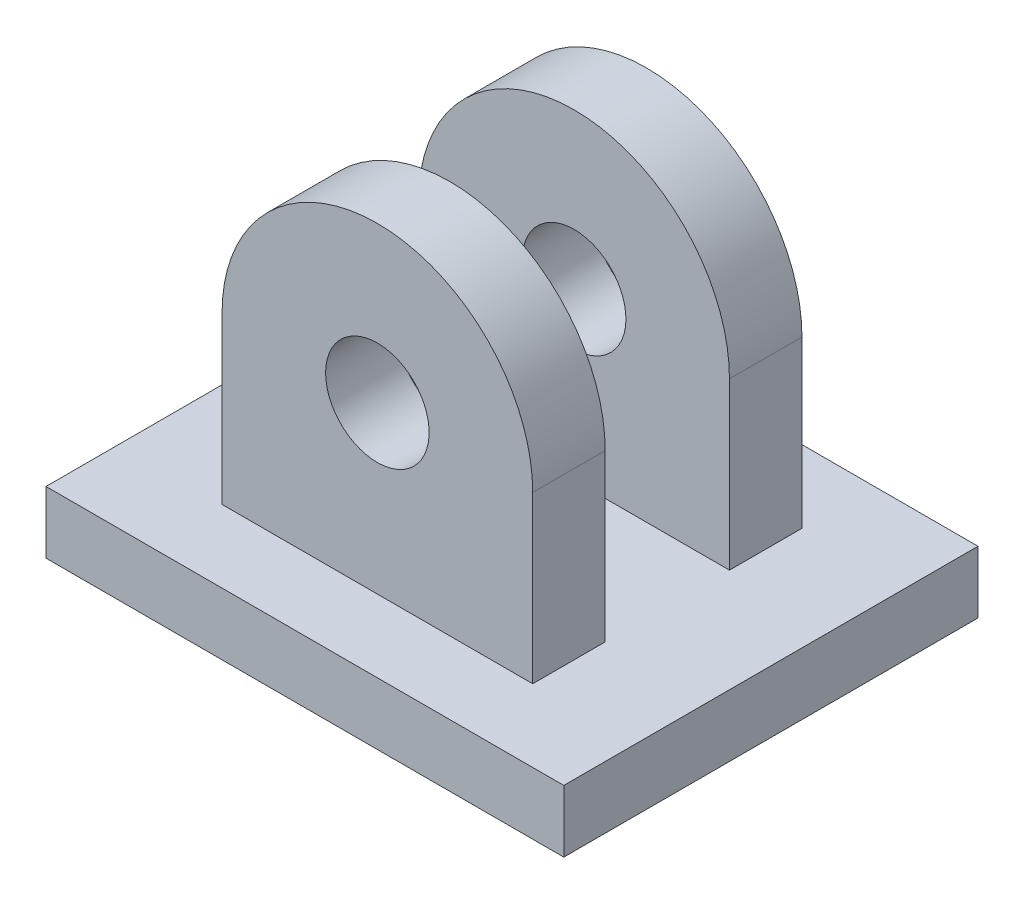
ISO-10303-21;
HEADER;
FILE_DESCRIPTION(('STEP AP214'),'2;1');
FILE_NAME('part.step','',(''),(''),'','','');
FILE_SCHEMA(('AUTOMOTIVE_DESIGN { 1 0 10303 214 1 1 1 1 }'));
ENDSEC;
DATA;
#1=APPLICATION_CONTEXT('core data for automotive mechanical design processes');
#2=APPLICATION_PROTOCOL_DEFINITION('international standard','automotive_design',2000,#1);
#3=PRODUCT_CONTEXT('',#1,'mechanical');
#4=PRODUCT('Part','Part','',(#3));
#5=PRODUCT_RELATED_PRODUCT_CATEGORY('part','',(#4));
#6=PRODUCT_DEFINITION_FORMATION('','',#4);
#7=PRODUCT_DEFINITION_CONTEXT('part definition',#1,'design');
#8=PRODUCT_DEFINITION('design','',#6,#7);
#9=PRODUCT_DEFINITION_SHAPE('','',#8);
#10=(LENGTH_UNIT() NAMED_UNIT(*) SI_UNIT(.MILLI.,.METRE.));
#11=(NAMED_UNIT(*) PLANE_ANGLE_UNIT() SI_UNIT($,.RADIAN.));
#12=(NAMED_UNIT(*) SI_UNIT($,.STERADIAN.) SOLID_ANGLE_UNIT());
#13=UNCERTAINTY_MEASURE_WITH_UNIT(LENGTH_MEASURE(1.E-05),#10,'distance_accuracy_value','');
#14=(GEOMETRIC_REPRESENTATION_CONTEXT(3) GLOBAL_UNCERTAINTY_ASSIGNED_CONTEXT((#13)) GLOBAL_UNIT_ASSIGNED_CONTEXT((#10,
#11,#12)) REPRESENTATION_CONTEXT('',''));
#15=CARTESIAN_POINT('',(0.,0.,0.));
#16=DIRECTION('',(0.,0.,1.));
#17=DIRECTION('',(1.,0.,0.));
#18=AXIS2_PLACEMENT_3D('',#15,#16,#17);
#19=CARTESIAN_POINT('',(15.,0.,40.));
#20=DIRECTION('',(-1.,0.,0.));
#21=DIRECTION('',(0.,-1.,0.));
#22=AXIS2_PLACEMENT_3D('',#19,#20,#21);
#23=PLANE('',#22);
#24=DIRECTION('',(0.,0.,-1.));
#25=VECTOR('',#24,1.);
#26=CARTESIAN_POINT('',(15.,-16.,40.));
#27=LINE('',#26,#25);
#28=CARTESIAN_POINT('',(15.,-16.,33.));
#29=VERTEX_POINT('',#28);
#30=CARTESIAN_POINT('',(15.,-16.,26.));
#31=VERTEX_POINT('',#30);
#32=EDGE_CURVE('E40',#29,#31,#27,.T.);
#33=ORIENTED_EDGE('',*,*,#32,.T.);
#34=DIRECTION('',(0.,-1.,0.));
#35=VECTOR('',#34,1.);
#36=CARTESIAN_POINT('',(15.,18.4995185574231,26.));
#37=LINE('',#36,#35);
#38=CARTESIAN_POINT('',(15.,0.,26.));
#39=VERTEX_POINT('',#38);
#40=EDGE_CURVE('E48',#39,#31,#37,.T.);
#41=ORIENTED_EDGE('',*,*,#40,.F.);
#42=DIRECTION('',(0.,0.,-1.));
#43=VECTOR('',#42,1.);
#44=CARTESIAN_POINT('',(15.,0.,40.));
#45=LINE('',#44,#43);
#46=CARTESIAN_POINT('',(15.,0.,33.));
#47=VERTEX_POINT('',#46);
#48=EDGE_CURVE('E143',#47,#39,#45,.T.);
#49=ORIENTED_EDGE('',*,*,#48,.F.);
#50=DIRECTION('',(0.,1.,0.));
#51=VECTOR('',#50,1.);
#52=CARTESIAN_POINT('',(15.,18.4995185574231,33.));
#53=LINE('',#52,#51);
#54=EDGE_CURVE('E177',#29,#47,#53,.T.);
#55=ORIENTED_EDGE('',*,*,#54,.F.);
#56=EDGE_LOOP('',(#33,#41,#49,#55));
#57=FACE_BOUND('',#56,.T.);
#58=ADVANCED_FACE('F31',(#57),#23,.F.);
#59=CARTESIAN_POINT('',(0.,0.,40.));
#60=DIRECTION('',(0.,0.,-1.));
#61=DIRECTION('',(-1.,0.,0.));
#62=AXIS2_PLACEMENT_3D('',#59,#60,#61);
#63=CYLINDRICAL_SURFACE('',#62,15.);
#64=ORIENTED_EDGE('',*,*,#48,.T.);
#65=CARTESIAN_POINT('',(0.,0.,26.));
#66=DIRECTION('',(0.,0.,1.));
#67=DIRECTION('',(1.,0.,0.));
#68=AXIS2_PLACEMENT_3D('',#65,#66,#67);
#69=CIRCLE('',#68,15.);
#70=CARTESIAN_POINT('',(-15.,0.,26.));
#71=VERTEX_POINT('',#70);
#72=EDGE_CURVE('E174',#39,#71,#69,.T.);
#73=ORIENTED_EDGE('',*,*,#72,.T.);
#74=DIRECTION('',(0.,0.,-1.));
#75=VECTOR('',#74,1.);
#76=CARTESIAN_POINT('',(-15.,0.,40.));
#77=LINE('',#76,#75);
#78=CARTESIAN_POINT('',(-15.,0.,33.));
#79=VERTEX_POINT('',#78);
#80=EDGE_CURVE('E222',#79,#71,#77,.T.);
#81=ORIENTED_EDGE('',*,*,#80,.F.);
#82=CARTESIAN_POINT('',(0.,0.,33.));
#83=DIRECTION('',(0.,0.,-1.));
#84=DIRECTION('',(-1.,0.,0.));
#85=AXIS2_PLACEMENT_3D('',#82,#83,#84);
#86=CIRCLE('',#85,15.);
#87=EDGE_CURVE('E182',#79,#47,#86,.T.);
#88=ORIENTED_EDGE('',*,*,#87,.T.);
#89=EDGE_LOOP('',(#64,#73,#81,#88));
#90=FACE_BOUND('',#89,.T.);
#91=ADVANCED_FACE('F237',(#90),#63,.T.);
#92=CARTESIAN_POINT('',(-15.,0.,40.));
#93=DIRECTION('',(1.,0.,0.));
#94=DIRECTION('',(0.,1.,0.));
#95=AXIS2_PLACEMENT_3D('',#92,#93,#94);
#96=PLANE('',#95);
#97=ORIENTED_EDGE('',*,*,#80,.T.);
#98=DIRECTION('',(0.,-1.,0.));
#99=VECTOR('',#98,1.);
#100=CARTESIAN_POINT('',(-15.,0.,26.));
#101=LINE('',#100,#99);
#102=CARTESIAN_POINT('',(-15.,-16.,26.));
#103=VERTEX_POINT('',#102);
#104=EDGE_CURVE('E171',#71,#103,#101,.T.);
#105=ORIENTED_EDGE('',*,*,#104,.T.);
#106=DIRECTION('',(0.,0.,-1.));
#107=VECTOR('',#106,1.);
#108=CARTESIAN_POINT('',(-15.,-16.,40.));
#109=LINE('',#108,#107);
#110=CARTESIAN_POINT('',(-15.,-16.,33.));
#111=VERTEX_POINT('',#110);
#112=EDGE_CURVE('E220',#111,#103,#109,.T.);
#113=ORIENTED_EDGE('',*,*,#112,.F.);
#114=DIRECTION('',(0.,1.,0.));
#115=VECTOR('',#114,1.);
#116=CARTESIAN_POINT('',(-15.,0.,33.));
#117=LINE('',#116,#115);
#118=EDGE_CURVE('E156',#111,#79,#117,.T.);
#119=ORIENTED_EDGE('',*,*,#118,.T.);
#120=EDGE_LOOP('',(#97,#105,#113,#119));
#121=FACE_BOUND('',#120,.T.);
#122=ADVANCED_FACE('F243',(#121),#96,.F.);
#123=CARTESIAN_POINT('',(0.,0.,40.));
#124=DIRECTION('',(0.,0.,-1.));
#125=DIRECTION('',(-1.,0.,0.));
#126=AXIS2_PLACEMENT_3D('',#123,#124,#125);
#127=CYLINDRICAL_SURFACE('',#126,5.);
#128=CARTESIAN_POINT('',(0.,0.,26.));
#129=DIRECTION('',(0.,0.,1.));
#130=DIRECTION('',(1.,0.,0.));
#131=AXIS2_PLACEMENT_3D('',#128,#129,#130);
#132=CIRCLE('',#131,5.);
#133=CARTESIAN_POINT('',(5.,0.,26.));
#134=VERTEX_POINT('',#133);
#135=EDGE_CURVE('E35',#134,#134,#132,.T.);
#136=ORIENTED_EDGE('',*,*,#135,.F.);
#137=EDGE_LOOP('',(#136));
#138=FACE_BOUND('',#137,.T.);
#139=CARTESIAN_POINT('',(0.,0.,33.));
#140=DIRECTION('',(0.,0.,-1.));
#141=DIRECTION('',(-1.,0.,0.));
#142=AXIS2_PLACEMENT_3D('',#139,#140,#141);
#143=CIRCLE('',#142,5.);
#144=CARTESIAN_POINT('',(-5.,0.,33.));
#145=VERTEX_POINT('',#144);
#146=EDGE_CURVE('E154',#145,#145,#143,.T.);
#147=ORIENTED_EDGE('',*,*,#146,.F.);
#148=EDGE_LOOP('',(#147));
#149=FACE_BOUND('',#148,.T.);
#150=ADVANCED_FACE('F275',(#138,#149),#127,.F.);
#151=CARTESIAN_POINT('',(0.,0.,40.));
#152=DIRECTION('',(0.,0.,1.));
#153=DIRECTION('',(1.,0.,0.));
#154=AXIS2_PLACEMENT_3D('',#151,#152,#153);
#155=PLANE('',#154);
#156=DIRECTION('',(-1.,0.,0.));
#157=VECTOR('',#156,1.);
#158=CARTESIAN_POINT('',(15.,-16.,40.));
#159=LINE('',#158,#157);
#160=CARTESIAN_POINT('',(25.,-16.,40.));
#161=VERTEX_POINT('',#160);
#162=CARTESIAN_POINT('',(-25.,-16.,40.));
#163=VERTEX_POINT('',#162);
#164=EDGE_CURVE('E197',#161,#163,#159,.T.);
#165=ORIENTED_EDGE('',*,*,#164,.T.);
#166=DIRECTION('',(0.,-1.,0.));
#167=VECTOR('',#166,1.);
#168=CARTESIAN_POINT('',(-25.,-16.,40.));
#169=LINE('',#168,#167);
#170=CARTESIAN_POINT('',(-25.,-22.,40.));
#171=VERTEX_POINT('',#170);
#172=EDGE_CURVE('E200',#163,#171,#169,.T.);
#173=ORIENTED_EDGE('',*,*,#172,.T.);
#174=DIRECTION('',(1.,0.,0.));
#175=VECTOR('',#174,1.);
#176=CARTESIAN_POINT('',(-25.,-22.,40.));
#177=LINE('',#176,#175);
#178=CARTESIAN_POINT('',(25.,-22.,40.));
#179=VERTEX_POINT('',#178);
#180=EDGE_CURVE('E202',#171,#179,#177,.T.);
#181=ORIENTED_EDGE('',*,*,#180,.T.);
#182=DIRECTION('',(0.,1.,0.));
#183=VECTOR('',#182,1.);
#184=CARTESIAN_POINT('',(25.,-22.,40.));
#185=LINE('',#184,#183);
#186=EDGE_CURVE('E194',#179,#161,#185,.T.);
#187=ORIENTED_EDGE('',*,*,#186,.T.);
#188=EDGE_LOOP('',(#165,#173,#181,#187));
#189=FACE_BOUND('',#188,.T.);
#190=ADVANCED_FACE('F276',(#189),#155,.T.);
#191=CARTESIAN_POINT('',(0.,0.,0.));
#192=DIRECTION('',(0.,0.,1.));
#193=DIRECTION('',(1.,0.,0.));
#194=AXIS2_PLACEMENT_3D('',#191,#192,#193);
#195=PLANE('',#194);
#196=DIRECTION('',(-1.,0.,0.));
#197=VECTOR('',#196,1.);
#198=CARTESIAN_POINT('',(-25.,-16.,0.));
#199=LINE('',#198,#197);
#200=CARTESIAN_POINT('',(25.,-16.,0.));
#201=VERTEX_POINT('',#200);
#202=CARTESIAN_POINT('',(-25.,-16.,0.));
#203=VERTEX_POINT('',#202);
#204=EDGE_CURVE('E207',#201,#203,#199,.T.);
#205=ORIENTED_EDGE('',*,*,#204,.F.);
#206=DIRECTION('',(0.,1.,0.));
#207=VECTOR('',#206,1.);
#208=CARTESIAN_POINT('',(25.,-22.,0.));
#209=LINE('',#208,#207);
#210=CARTESIAN_POINT('',(25.,-22.,0.));
#211=VERTEX_POINT('',#210);
#212=EDGE_CURVE('E193',#211,#201,#209,.T.);
#213=ORIENTED_EDGE('',*,*,#212,.F.);
#214=DIRECTION('',(1.,0.,0.));
#215=VECTOR('',#214,1.);
#216=CARTESIAN_POINT('',(-25.,-22.,0.));
#217=LINE('',#216,#215);
#218=CARTESIAN_POINT('',(-25.,-22.,0.));
#219=VERTEX_POINT('',#218);
#220=EDGE_CURVE('E198',#219,#211,#217,.T.);
#221=ORIENTED_EDGE('',*,*,#220,.F.);
#222=DIRECTION('',(0.,-1.,0.));
#223=VECTOR('',#222,1.);
#224=CARTESIAN_POINT('',(-25.,-16.,0.));
#225=LINE('',#224,#223);
#226=EDGE_CURVE('E210',#203,#219,#225,.T.);
#227=ORIENTED_EDGE('',*,*,#226,.F.);
#228=EDGE_LOOP('',(#205,#213,#221,#227));
#229=FACE_BOUND('',#228,.T.);
#230=ADVANCED_FACE('F279',(#229),#195,.F.);
#231=CARTESIAN_POINT('',(25.,-22.,40.));
#232=DIRECTION('',(-1.,0.,0.));
#233=DIRECTION('',(0.,0.,1.));
#234=AXIS2_PLACEMENT_3D('',#231,#232,#233);
#235=PLANE('',#234);
#236=ORIENTED_EDGE('',*,*,#212,.T.);
#237=DIRECTION('',(0.,0.,-1.));
#238=VECTOR('',#237,1.);
#239=CARTESIAN_POINT('',(25.,-16.,40.));
#240=LINE('',#239,#238);
#241=EDGE_CURVE('E11',#161,#201,#240,.T.);
#242=ORIENTED_EDGE('',*,*,#241,.F.);
#243=ORIENTED_EDGE('',*,*,#186,.F.);
#244=DIRECTION('',(0.,0.,-1.));
#245=VECTOR('',#244,1.);
#246=CARTESIAN_POINT('',(25.,-22.,40.));
#247=LINE('',#246,#245);
#248=EDGE_CURVE('E204',#179,#211,#247,.T.);
#249=ORIENTED_EDGE('',*,*,#248,.T.);
#250=EDGE_LOOP('',(#236,#242,#243,#249));
#251=FACE_BOUND('',#250,.T.);
#252=ADVANCED_FACE('F33',(#251),#235,.F.);
#253=CARTESIAN_POINT('',(15.,0.,14.));
#254=VERTEX_POINT('',#253);
#255=CARTESIAN_POINT('',(15.,0.,7.));
#256=VERTEX_POINT('',#255);
#257=EDGE_CURVE('E137',#254,#256,#45,.T.);
#258=ORIENTED_EDGE('',*,*,#257,.F.);
#259=DIRECTION('',(0.,1.,0.));
#260=VECTOR('',#259,1.);
#261=CARTESIAN_POINT('',(15.,-16.,14.));
#262=LINE('',#261,#260);
#263=CARTESIAN_POINT('',(15.,-16.,14.));
#264=VERTEX_POINT('',#263);
#265=EDGE_CURVE('E125',#264,#254,#262,.T.);
#266=ORIENTED_EDGE('',*,*,#265,.F.);
#267=CARTESIAN_POINT('',(15.,-16.,7.));
#268=VERTEX_POINT('',#267);
#269=EDGE_CURVE('E136',#264,#268,#27,.T.);
#270=ORIENTED_EDGE('',*,*,#269,.T.);
#271=DIRECTION('',(0.,-1.,0.));
#272=VECTOR('',#271,1.);
#273=CARTESIAN_POINT('',(15.,-16.,7.));
#274=LINE('',#273,#272);
#275=EDGE_CURVE('E185',#256,#268,#274,.T.);
#276=ORIENTED_EDGE('',*,*,#275,.F.);
#277=EDGE_LOOP('',(#258,#266,#270,#276));
#278=FACE_BOUND('',#277,.T.);
#279=ADVANCED_FACE('F134',(#278),#23,.F.);
#280=CARTESIAN_POINT('',(-15.,0.,14.));
#281=VERTEX_POINT('',#280);
#282=CARTESIAN_POINT('',(-15.,0.,7.));
#283=VERTEX_POINT('',#282);
#284=EDGE_CURVE('E221',#281,#283,#77,.T.);
#285=ORIENTED_EDGE('',*,*,#284,.F.);
#286=CARTESIAN_POINT('',(0.,0.,14.));
#287=DIRECTION('',(0.,0.,-1.));
#288=DIRECTION('',(0.,1.,0.));
#289=AXIS2_PLACEMENT_3D('',#286,#287,#288);
#290=CIRCLE('',#289,15.);
#291=EDGE_CURVE('E162',#281,#254,#290,.T.);
#292=ORIENTED_EDGE('',*,*,#291,.T.);
#293=ORIENTED_EDGE('',*,*,#257,.T.);
#294=CARTESIAN_POINT('',(0.,0.,7.));
#295=DIRECTION('',(0.,0.,1.));
#296=DIRECTION('',(0.,-1.,0.));
#297=AXIS2_PLACEMENT_3D('',#294,#295,#296);
#298=CIRCLE('',#297,15.);
#299=EDGE_CURVE('E190',#256,#283,#298,.T.);
#300=ORIENTED_EDGE('',*,*,#299,.T.);
#301=EDGE_LOOP('',(#285,#292,#293,#300));
#302=FACE_BOUND('',#301,.T.);
#303=ADVANCED_FACE('F234',(#302),#63,.T.);
#304=CARTESIAN_POINT('',(-15.,-16.,14.));
#305=VERTEX_POINT('',#304);
#306=CARTESIAN_POINT('',(-15.,-16.,7.));
#307=VERTEX_POINT('',#306);
#308=EDGE_CURVE('E56',#305,#307,#109,.T.);
#309=ORIENTED_EDGE('',*,*,#308,.F.);
#310=DIRECTION('',(0.,1.,0.));
#311=VECTOR('',#310,1.);
#312=CARTESIAN_POINT('',(-15.,0.,14.));
#313=LINE('',#312,#311);
#314=EDGE_CURVE('E128',#305,#281,#313,.T.);
#315=ORIENTED_EDGE('',*,*,#314,.T.);
#316=ORIENTED_EDGE('',*,*,#284,.T.);
#317=DIRECTION('',(0.,-1.,0.));
#318=VECTOR('',#317,1.);
#319=CARTESIAN_POINT('',(-15.,0.,7.));
#320=LINE('',#319,#318);
#321=EDGE_CURVE('E153',#283,#307,#320,.T.);
#322=ORIENTED_EDGE('',*,*,#321,.T.);
#323=EDGE_LOOP('',(#309,#315,#316,#322));
#324=FACE_BOUND('',#323,.T.);
#325=ADVANCED_FACE('F229',(#324),#96,.F.);
#326=CARTESIAN_POINT('',(-25.,-16.,40.));
#327=DIRECTION('',(0.,-1.,0.));
#328=DIRECTION('',(0.,0.,-1.));
#329=AXIS2_PLACEMENT_3D('',#326,#327,#328);
#330=PLANE('',#329);
#331=DIRECTION('',(1.,0.,0.));
#332=VECTOR('',#331,1.);
#333=CARTESIAN_POINT('',(-25.,-16.,14.));
#334=LINE('',#333,#332);
#335=EDGE_CURVE('E122',#305,#264,#334,.T.);
#336=ORIENTED_EDGE('',*,*,#335,.F.);
#337=ORIENTED_EDGE('',*,*,#308,.T.);
#338=DIRECTION('',(1.,0.,0.));
#339=VECTOR('',#338,1.);
#340=CARTESIAN_POINT('',(-25.,-16.,7.));
#341=LINE('',#340,#339);
#342=EDGE_CURVE('E141',#307,#268,#341,.T.);
#343=ORIENTED_EDGE('',*,*,#342,.T.);
#344=ORIENTED_EDGE('',*,*,#269,.F.);
#345=EDGE_LOOP('',(#336,#337,#343,#344));
#346=FACE_BOUND('',#345,.T.);
#347=ORIENTED_EDGE('',*,*,#204,.T.);
#348=DIRECTION('',(0.,0.,-1.));
#349=VECTOR('',#348,1.);
#350=CARTESIAN_POINT('',(-25.,-16.,40.));
#351=LINE('',#350,#349);
#352=EDGE_CURVE('E218',#163,#203,#351,.T.);
#353=ORIENTED_EDGE('',*,*,#352,.F.);
#354=ORIENTED_EDGE('',*,*,#164,.F.);
#355=ORIENTED_EDGE('',*,*,#241,.T.);
#356=EDGE_LOOP('',(#347,#353,#354,#355));
#357=FACE_BOUND('',#356,.T.);
#358=ORIENTED_EDGE('',*,*,#112,.T.);
#359=DIRECTION('',(1.,0.,0.));
#360=VECTOR('',#359,1.);
#361=CARTESIAN_POINT('',(-25.,-16.,26.));
#362=LINE('',#361,#360);
#363=EDGE_CURVE('E130',#103,#31,#362,.T.);
#364=ORIENTED_EDGE('',*,*,#363,.T.);
#365=ORIENTED_EDGE('',*,*,#32,.F.);
#366=DIRECTION('',(1.,0.,0.));
#367=VECTOR('',#366,1.);
#368=CARTESIAN_POINT('',(-25.,-16.,33.));
#369=LINE('',#368,#367);
#370=EDGE_CURVE('E157',#111,#29,#369,.T.);
#371=ORIENTED_EDGE('',*,*,#370,.F.);
#372=EDGE_LOOP('',(#358,#364,#365,#371));
#373=FACE_BOUND('',#372,.T.);
#374=ADVANCED_FACE('F139',(#346,#357,#373),#330,.F.);
#375=CARTESIAN_POINT('',(-25.,-16.,40.));
#376=DIRECTION('',(1.,0.,0.));
#377=DIRECTION('',(0.,0.,-1.));
#378=AXIS2_PLACEMENT_3D('',#375,#376,#377);
#379=PLANE('',#378);
#380=ORIENTED_EDGE('',*,*,#226,.T.);
#381=DIRECTION('',(0.,0.,-1.));
#382=VECTOR('',#381,1.);
#383=CARTESIAN_POINT('',(-25.,-22.,40.));
#384=LINE('',#383,#382);
#385=EDGE_CURVE('E215',#171,#219,#384,.T.);
#386=ORIENTED_EDGE('',*,*,#385,.F.);
#387=ORIENTED_EDGE('',*,*,#172,.F.);
#388=ORIENTED_EDGE('',*,*,#352,.T.);
#389=EDGE_LOOP('',(#380,#386,#387,#388));
#390=FACE_BOUND('',#389,.T.);
#391=ADVANCED_FACE('F286',(#390),#379,.F.);
#392=CARTESIAN_POINT('',(-25.,-22.,40.));
#393=DIRECTION('',(0.,1.,0.));
#394=DIRECTION('',(0.,0.,1.));
#395=AXIS2_PLACEMENT_3D('',#392,#393,#394);
#396=PLANE('',#395);
#397=ORIENTED_EDGE('',*,*,#220,.T.);
#398=ORIENTED_EDGE('',*,*,#248,.F.);
#399=ORIENTED_EDGE('',*,*,#180,.F.);
#400=ORIENTED_EDGE('',*,*,#385,.T.);
#401=EDGE_LOOP('',(#397,#398,#399,#400));
#402=FACE_BOUND('',#401,.T.);
#403=ADVANCED_FACE('F273',(#402),#396,.F.);
#404=CARTESIAN_POINT('',(0.,0.,14.));
#405=DIRECTION('',(0.,0.,-1.));
#406=DIRECTION('',(0.,1.,0.));
#407=AXIS2_PLACEMENT_3D('',#404,#405,#406);
#408=CIRCLE('',#407,5.);
#409=CARTESIAN_POINT('',(0.,5.,14.));
#410=VERTEX_POINT('',#409);
#411=EDGE_CURVE('E158',#410,#410,#408,.T.);
#412=ORIENTED_EDGE('',*,*,#411,.F.);
#413=EDGE_LOOP('',(#412));
#414=FACE_BOUND('',#413,.T.);
#415=CARTESIAN_POINT('',(0.,0.,7.));
#416=DIRECTION('',(0.,0.,1.));
#417=DIRECTION('',(0.,-1.,0.));
#418=AXIS2_PLACEMENT_3D('',#415,#416,#417);
#419=CIRCLE('',#418,5.);
#420=CARTESIAN_POINT('',(0.,-5.,7.));
#421=VERTEX_POINT('',#420);
#422=EDGE_CURVE('E150',#421,#421,#419,.T.);
#423=ORIENTED_EDGE('',*,*,#422,.F.);
#424=EDGE_LOOP('',(#423));
#425=FACE_BOUND('',#424,.T.);
#426=ADVANCED_FACE('F266',(#414,#425),#127,.F.);
#427=CARTESIAN_POINT('',(-25.,-16.,7.));
#428=DIRECTION('',(0.,0.,1.));
#429=DIRECTION('',(0.,-1.,0.));
#430=AXIS2_PLACEMENT_3D('',#427,#428,#429);
#431=PLANE('',#430);
#432=ORIENTED_EDGE('',*,*,#422,.T.);
#433=EDGE_LOOP('',(#432));
#434=FACE_BOUND('',#433,.T.);
#435=ORIENTED_EDGE('',*,*,#275,.T.);
#436=ORIENTED_EDGE('',*,*,#342,.F.);
#437=ORIENTED_EDGE('',*,*,#321,.F.);
#438=ORIENTED_EDGE('',*,*,#299,.F.);
#439=EDGE_LOOP('',(#435,#436,#437,#438));
#440=FACE_BOUND('',#439,.T.);
#441=ADVANCED_FACE('F233',(#434,#440),#431,.F.);
#442=CARTESIAN_POINT('',(-25.,18.4995185574231,33.));
#443=DIRECTION('',(0.,0.,-1.));
#444=DIRECTION('',(-1.,0.,0.));
#445=AXIS2_PLACEMENT_3D('',#442,#443,#444);
#446=PLANE('',#445);
#447=ORIENTED_EDGE('',*,*,#146,.T.);
#448=EDGE_LOOP('',(#447));
#449=FACE_BOUND('',#448,.T.);
#450=ORIENTED_EDGE('',*,*,#118,.F.);
#451=ORIENTED_EDGE('',*,*,#370,.T.);
#452=ORIENTED_EDGE('',*,*,#54,.T.);
#453=ORIENTED_EDGE('',*,*,#87,.F.);
#454=EDGE_LOOP('',(#450,#451,#452,#453));
#455=FACE_BOUND('',#454,.T.);
#456=ADVANCED_FACE('F256',(#449,#455),#446,.F.);
#457=CARTESIAN_POINT('',(-25.,18.4995185574231,26.));
#458=DIRECTION('',(0.,0.,1.));
#459=DIRECTION('',(1.,0.,0.));
#460=AXIS2_PLACEMENT_3D('',#457,#458,#459);
#461=PLANE('',#460);
#462=ORIENTED_EDGE('',*,*,#135,.T.);
#463=EDGE_LOOP('',(#462));
#464=FACE_BOUND('',#463,.T.);
#465=ORIENTED_EDGE('',*,*,#40,.T.);
#466=ORIENTED_EDGE('',*,*,#363,.F.);
#467=ORIENTED_EDGE('',*,*,#104,.F.);
#468=ORIENTED_EDGE('',*,*,#72,.F.);
#469=EDGE_LOOP('',(#465,#466,#467,#468));
#470=FACE_BOUND('',#469,.T.);
#471=ADVANCED_FACE('F255',(#464,#470),#461,.F.);
#472=CARTESIAN_POINT('',(-25.,-16.,14.));
#473=DIRECTION('',(0.,0.,-1.));
#474=DIRECTION('',(0.,1.,0.));
#475=AXIS2_PLACEMENT_3D('',#472,#473,#474);
#476=PLANE('',#475);
#477=ORIENTED_EDGE('',*,*,#411,.T.);
#478=EDGE_LOOP('',(#477));
#479=FACE_BOUND('',#478,.T.);
#480=ORIENTED_EDGE('',*,*,#314,.F.);
#481=ORIENTED_EDGE('',*,*,#335,.T.);
#482=ORIENTED_EDGE('',*,*,#265,.T.);
#483=ORIENTED_EDGE('',*,*,#291,.F.);
#484=EDGE_LOOP('',(#480,#481,#482,#483));
#485=FACE_BOUND('',#484,.T.);
#486=ADVANCED_FACE('F124',(#479,#485),#476,.F.);
#487=CLOSED_SHELL('',(#58,#91,#122,#150,#190,#230,#252,#279,#303,#325,#374,#391,#403,#426,#441,
#456,#471,#486));
#488=MANIFOLD_SOLID_BREP('B2',#487);
#489=ADVANCED_BREP_SHAPE_REPRESENTATION('',(#18,#488),#14);
#490=SHAPE_DEFINITION_REPRESENTATION(#9,#489);
ENDSEC;
END-ISO-10303-21;
